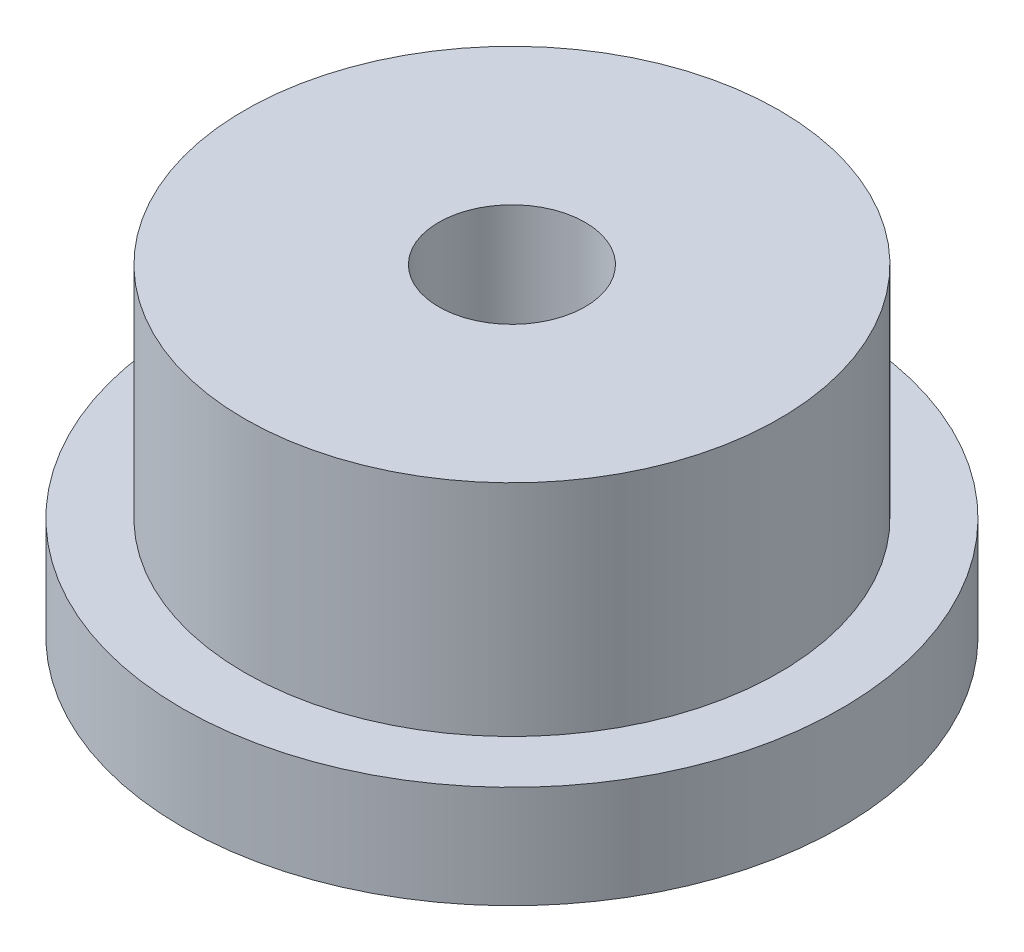
ISO-10303-21;
HEADER;
FILE_DESCRIPTION(('STEP AP214'),'2;1');
FILE_NAME('part.step','',(''),(''),'','','');
FILE_SCHEMA(('AUTOMOTIVE_DESIGN { 1 0 10303 214 1 1 1 1 }'));
ENDSEC;
DATA;
#1=APPLICATION_CONTEXT('core data for automotive mechanical design processes');
#2=APPLICATION_PROTOCOL_DEFINITION('international standard','automotive_design',2000,#1);
#3=PRODUCT_CONTEXT('',#1,'mechanical');
#4=PRODUCT('Part','Part','',(#3));
#5=PRODUCT_RELATED_PRODUCT_CATEGORY('part','',(#4));
#6=PRODUCT_DEFINITION_FORMATION('','',#4);
#7=PRODUCT_DEFINITION_CONTEXT('part definition',#1,'design');
#8=PRODUCT_DEFINITION('design','',#6,#7);
#9=PRODUCT_DEFINITION_SHAPE('','',#8);
#10=(LENGTH_UNIT() NAMED_UNIT(*) SI_UNIT(.MILLI.,.METRE.));
#11=(NAMED_UNIT(*) PLANE_ANGLE_UNIT() SI_UNIT($,.RADIAN.));
#12=(NAMED_UNIT(*) SI_UNIT($,.STERADIAN.) SOLID_ANGLE_UNIT());
#13=UNCERTAINTY_MEASURE_WITH_UNIT(LENGTH_MEASURE(1.E-05),#10,'distance_accuracy_value','');
#14=(GEOMETRIC_REPRESENTATION_CONTEXT(3) GLOBAL_UNCERTAINTY_ASSIGNED_CONTEXT((#13)) GLOBAL_UNIT_ASSIGNED_CONTEXT((#10,
#11,#12)) REPRESENTATION_CONTEXT('',''));
#15=CARTESIAN_POINT('',(0.,0.,0.));
#16=DIRECTION('',(0.,0.,1.));
#17=DIRECTION('',(1.,0.,0.));
#18=AXIS2_PLACEMENT_3D('',#15,#16,#17);
#19=CARTESIAN_POINT('',(0.,7.,0.));
#20=DIRECTION('',(0.,-1.,0.));
#21=DIRECTION('',(0.,0.,-1.));
#22=AXIS2_PLACEMENT_3D('',#19,#20,#21);
#23=CYLINDRICAL_SURFACE('',#22,22.5);
#24=CARTESIAN_POINT('',(0.,7.,0.));
#25=DIRECTION('',(0.,1.,0.));
#26=DIRECTION('',(0.,0.,1.));
#27=AXIS2_PLACEMENT_3D('',#24,#25,#26);
#28=CIRCLE('',#27,22.5);
#29=CARTESIAN_POINT('',(0.,7.,22.5));
#30=VERTEX_POINT('',#29);
#31=EDGE_CURVE('E51',#30,#30,#28,.T.);
#32=ORIENTED_EDGE('',*,*,#31,.F.);
#33=EDGE_LOOP('',(#32));
#34=FACE_BOUND('',#33,.T.);
#35=CARTESIAN_POINT('',(0.,0.,0.));
#36=DIRECTION('',(0.,1.,0.));
#37=DIRECTION('',(0.,0.,1.));
#38=AXIS2_PLACEMENT_3D('',#35,#36,#37);
#39=CIRCLE('',#38,22.5);
#40=CARTESIAN_POINT('',(0.,0.,22.5));
#41=VERTEX_POINT('',#40);
#42=EDGE_CURVE('E46',#41,#41,#39,.T.);
#43=ORIENTED_EDGE('',*,*,#42,.T.);
#44=EDGE_LOOP('',(#43));
#45=FACE_BOUND('',#44,.T.);
#46=ADVANCED_FACE('F43',(#34,#45),#23,.T.);
#47=CARTESIAN_POINT('',(0.,7.,0.));
#48=DIRECTION('',(0.,1.,0.));
#49=DIRECTION('',(0.,0.,1.));
#50=AXIS2_PLACEMENT_3D('',#47,#48,#49);
#51=PLANE('',#50);
#52=CARTESIAN_POINT('',(0.,7.,0.));
#53=DIRECTION('',(0.,1.,0.));
#54=DIRECTION('',(0.,0.,1.));
#55=AXIS2_PLACEMENT_3D('',#52,#53,#54);
#56=CIRCLE('',#55,18.25);
#57=CARTESIAN_POINT('',(0.,7.,18.25));
#58=VERTEX_POINT('',#57);
#59=EDGE_CURVE('E10',#58,#58,#56,.T.);
#60=ORIENTED_EDGE('',*,*,#59,.F.);
#61=EDGE_LOOP('',(#60));
#62=FACE_BOUND('',#61,.T.);
#63=ORIENTED_EDGE('',*,*,#31,.T.);
#64=EDGE_LOOP('',(#63));
#65=FACE_BOUND('',#64,.T.);
#66=ADVANCED_FACE('F89',(#62,#65),#51,.T.);
#67=CARTESIAN_POINT('',(0.,0.,0.));
#68=DIRECTION('',(0.,1.,0.));
#69=DIRECTION('',(0.,0.,1.));
#70=AXIS2_PLACEMENT_3D('',#67,#68,#69);
#71=PLANE('',#70);
#72=CARTESIAN_POINT('',(0.,0.,0.));
#73=DIRECTION('',(0.,-1.,0.));
#74=DIRECTION('',(0.,0.,-1.));
#75=AXIS2_PLACEMENT_3D('',#72,#73,#74);
#76=CIRCLE('',#75,9.03);
#77=CARTESIAN_POINT('',(0.,0.,-9.03));
#78=VERTEX_POINT('',#77);
#79=EDGE_CURVE('E78',#78,#78,#76,.T.);
#80=ORIENTED_EDGE('',*,*,#79,.F.);
#81=EDGE_LOOP('',(#80));
#82=FACE_BOUND('',#81,.T.);
#83=ORIENTED_EDGE('',*,*,#42,.F.);
#84=EDGE_LOOP('',(#83));
#85=FACE_BOUND('',#84,.T.);
#86=ADVANCED_FACE('F85',(#82,#85),#71,.F.);
#87=CARTESIAN_POINT('',(0.,22.,0.));
#88=DIRECTION('',(0.,-1.,0.));
#89=DIRECTION('',(0.,0.,-1.));
#90=AXIS2_PLACEMENT_3D('',#87,#88,#89);
#91=CYLINDRICAL_SURFACE('',#90,18.25);
#92=CARTESIAN_POINT('',(0.,22.,0.));
#93=DIRECTION('',(0.,1.,0.));
#94=DIRECTION('',(0.,0.,1.));
#95=AXIS2_PLACEMENT_3D('',#92,#93,#94);
#96=CIRCLE('',#95,18.25);
#97=CARTESIAN_POINT('',(0.,22.,18.25));
#98=VERTEX_POINT('',#97);
#99=EDGE_CURVE('E58',#98,#98,#96,.T.);
#100=ORIENTED_EDGE('',*,*,#99,.F.);
#101=EDGE_LOOP('',(#100));
#102=FACE_BOUND('',#101,.T.);
#103=ORIENTED_EDGE('',*,*,#59,.T.);
#104=EDGE_LOOP('',(#103));
#105=FACE_BOUND('',#104,.T.);
#106=ADVANCED_FACE('F88',(#102,#105),#91,.T.);
#107=CARTESIAN_POINT('',(0.,22.,0.));
#108=DIRECTION('',(0.,1.,0.));
#109=DIRECTION('',(0.,0.,1.));
#110=AXIS2_PLACEMENT_3D('',#107,#108,#109);
#111=PLANE('',#110);
#112=CARTESIAN_POINT('',(0.,22.,0.));
#113=DIRECTION('',(0.,-1.,0.));
#114=DIRECTION('',(0.,0.,-1.));
#115=AXIS2_PLACEMENT_3D('',#112,#113,#114);
#116=CIRCLE('',#115,4.99999999999999);
#117=CARTESIAN_POINT('',(0.,22.,-4.99999999999999));
#118=VERTEX_POINT('',#117);
#119=EDGE_CURVE('E62',#118,#118,#116,.T.);
#120=ORIENTED_EDGE('',*,*,#119,.T.);
#121=EDGE_LOOP('',(#120));
#122=FACE_BOUND('',#121,.T.);
#123=ORIENTED_EDGE('',*,*,#99,.T.);
#124=EDGE_LOOP('',(#123));
#125=FACE_BOUND('',#124,.T.);
#126=ADVANCED_FACE('F108',(#122,#125),#111,.T.);
#127=CARTESIAN_POINT('',(0.,0.,0.));
#128=DIRECTION('',(0.,-1.,0.));
#129=DIRECTION('',(0.,0.,-1.));
#130=AXIS2_PLACEMENT_3D('',#127,#128,#129);
#131=CYLINDRICAL_SURFACE('',#130,5.);
#132=ORIENTED_EDGE('',*,*,#119,.F.);
#133=EDGE_LOOP('',(#132));
#134=FACE_BOUND('',#133,.T.);
#135=CARTESIAN_POINT('',(0.,11.68,0.));
#136=DIRECTION('',(0.,-1.,0.));
#137=DIRECTION('',(0.,0.,-1.));
#138=AXIS2_PLACEMENT_3D('',#135,#136,#137);
#139=CIRCLE('',#138,5.);
#140=CARTESIAN_POINT('',(0.,11.68,-5.));
#141=VERTEX_POINT('',#140);
#142=EDGE_CURVE('E66',#141,#141,#139,.T.);
#143=ORIENTED_EDGE('',*,*,#142,.T.);
#144=EDGE_LOOP('',(#143));
#145=FACE_BOUND('',#144,.T.);
#146=ADVANCED_FACE('F112',(#134,#145),#131,.F.);
#147=CARTESIAN_POINT('',(9.005,11.68,0.));
#148=DIRECTION('',(0.,1.,0.));
#149=DIRECTION('',(0.,0.,1.));
#150=AXIS2_PLACEMENT_3D('',#147,#148,#149);
#151=PLANE('',#150);
#152=ORIENTED_EDGE('',*,*,#142,.F.);
#153=EDGE_LOOP('',(#152));
#154=FACE_BOUND('',#153,.T.);
#155=CARTESIAN_POINT('',(0.,11.68,0.));
#156=DIRECTION('',(0.,-1.,0.));
#157=DIRECTION('',(0.,0.,-1.));
#158=AXIS2_PLACEMENT_3D('',#155,#156,#157);
#159=CIRCLE('',#158,9.005);
#160=CARTESIAN_POINT('',(0.,11.68,-9.005));
#161=VERTEX_POINT('',#160);
#162=EDGE_CURVE('E70',#161,#161,#159,.T.);
#163=ORIENTED_EDGE('',*,*,#162,.T.);
#164=EDGE_LOOP('',(#163));
#165=FACE_BOUND('',#164,.T.);
#166=ADVANCED_FACE('F116',(#154,#165),#151,.F.);
#167=CARTESIAN_POINT('',(0.,0.,0.));
#168=DIRECTION('',(0.,-1.,0.));
#169=DIRECTION('',(0.,0.,-1.));
#170=AXIS2_PLACEMENT_3D('',#167,#168,#169);
#171=CYLINDRICAL_SURFACE('',#170,9.005);
#172=ORIENTED_EDGE('',*,*,#162,.F.);
#173=EDGE_LOOP('',(#172));
#174=FACE_BOUND('',#173,.T.);
#175=CARTESIAN_POINT('',(0.,0.0250000000000051,0.));
#176=DIRECTION('',(0.,-1.,0.));
#177=DIRECTION('',(0.,0.,-1.));
#178=AXIS2_PLACEMENT_3D('',#175,#176,#177);
#179=CIRCLE('',#178,9.00499999999999);
#180=CARTESIAN_POINT('',(0.,0.0250000000000051,-9.00499999999999));
#181=VERTEX_POINT('',#180);
#182=EDGE_CURVE('E74',#181,#181,#179,.T.);
#183=ORIENTED_EDGE('',*,*,#182,.T.);
#184=EDGE_LOOP('',(#183));
#185=FACE_BOUND('',#184,.T.);
#186=ADVANCED_FACE('F120',(#174,#185),#171,.F.);
#187=CARTESIAN_POINT('',(0.,0.,0.));
#188=DIRECTION('',(0.,-1.,0.));
#189=DIRECTION('',(0.,0.,-1.));
#190=AXIS2_PLACEMENT_3D('',#187,#188,#189);
#191=CONICAL_SURFACE('',#190,9.03,0.785398163397466);
#192=ORIENTED_EDGE('',*,*,#182,.F.);
#193=EDGE_LOOP('',(#192));
#194=FACE_BOUND('',#193,.T.);
#195=ORIENTED_EDGE('',*,*,#79,.T.);
#196=EDGE_LOOP('',(#195));
#197=FACE_BOUND('',#196,.T.);
#198=ADVANCED_FACE('F83',(#194,#197),#191,.F.);
#199=CLOSED_SHELL('',(#46,#66,#86,#106,#126,#146,#166,#186,#198));
#200=MANIFOLD_SOLID_BREP('B2',#199);
#201=ADVANCED_BREP_SHAPE_REPRESENTATION('',(#18,#200),#14);
#202=SHAPE_DEFINITION_REPRESENTATION(#9,#201);
ENDSEC;
END-ISO-10303-21;
